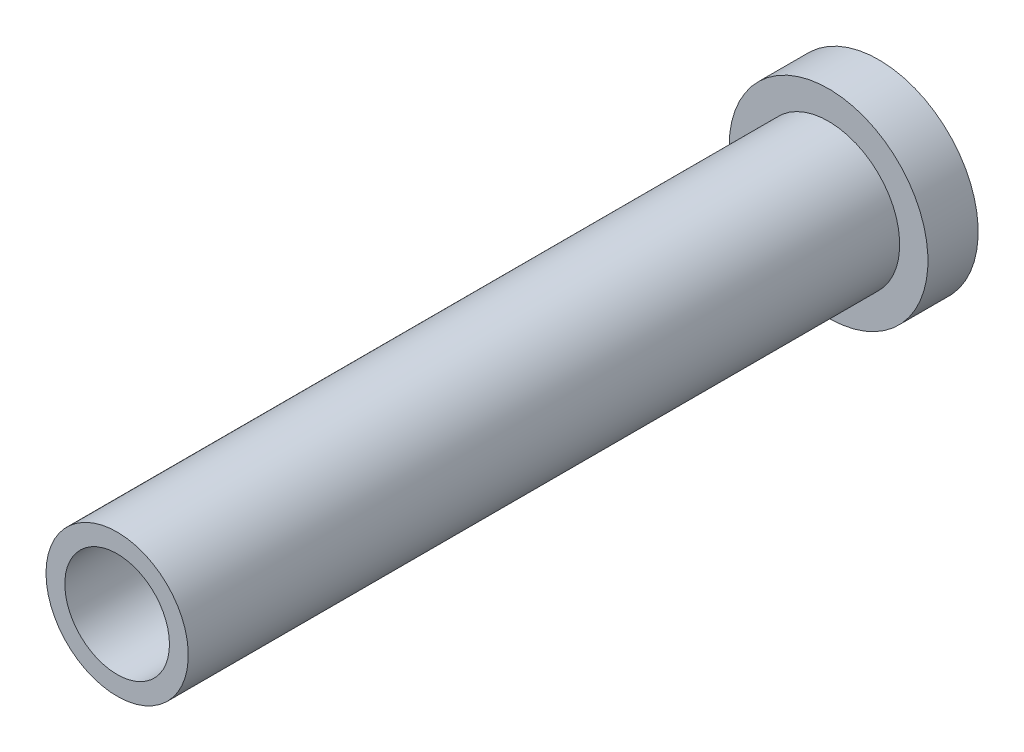
ISO-10303-21;
HEADER;
FILE_DESCRIPTION(('STEP AP214'),'2;1');
FILE_NAME('part.step','',(''),(''),'','','');
FILE_SCHEMA(('AUTOMOTIVE_DESIGN { 1 0 10303 214 1 1 1 1 }'));
ENDSEC;
DATA;
#1=APPLICATION_CONTEXT('core data for automotive mechanical design processes');
#2=APPLICATION_PROTOCOL_DEFINITION('international standard','automotive_design',2000,#1);
#3=PRODUCT_CONTEXT('',#1,'mechanical');
#4=PRODUCT('Part','Part','',(#3));
#5=PRODUCT_RELATED_PRODUCT_CATEGORY('part','',(#4));
#6=PRODUCT_DEFINITION_FORMATION('','',#4);
#7=PRODUCT_DEFINITION_CONTEXT('part definition',#1,'design');
#8=PRODUCT_DEFINITION('design','',#6,#7);
#9=PRODUCT_DEFINITION_SHAPE('','',#8);
#10=(LENGTH_UNIT() NAMED_UNIT(*) SI_UNIT(.MILLI.,.METRE.));
#11=(NAMED_UNIT(*) PLANE_ANGLE_UNIT() SI_UNIT($,.RADIAN.));
#12=(NAMED_UNIT(*) SI_UNIT($,.STERADIAN.) SOLID_ANGLE_UNIT());
#13=UNCERTAINTY_MEASURE_WITH_UNIT(LENGTH_MEASURE(1.E-05),#10,'distance_accuracy_value','');
#14=(GEOMETRIC_REPRESENTATION_CONTEXT(3) GLOBAL_UNCERTAINTY_ASSIGNED_CONTEXT((#13)) GLOBAL_UNIT_ASSIGNED_CONTEXT((#10,
#11,#12)) REPRESENTATION_CONTEXT('',''));
#15=CARTESIAN_POINT('',(0.,0.,0.));
#16=DIRECTION('',(0.,0.,1.));
#17=DIRECTION('',(1.,0.,0.));
#18=AXIS2_PLACEMENT_3D('',#15,#16,#17);
#19=CARTESIAN_POINT('',(0.,0.,2.39999999999999));
#20=DIRECTION('',(0.,0.,-1.));
#21=DIRECTION('',(-1.,0.,0.));
#22=AXIS2_PLACEMENT_3D('',#19,#20,#21);
#23=CYLINDRICAL_SURFACE('',#22,4.75);
#24=CARTESIAN_POINT('',(0.,0.,2.39999999999999));
#25=DIRECTION('',(0.,0.,1.));
#26=DIRECTION('',(1.,0.,0.));
#27=AXIS2_PLACEMENT_3D('',#24,#25,#26);
#28=CIRCLE('',#27,4.75);
#29=CARTESIAN_POINT('',(-4.74999999999994,0.,2.39999999999999));
#30=VERTEX_POINT('',#29);
#31=EDGE_CURVE('E39',#30,#30,#28,.T.);
#32=CARTESIAN_POINT('',(0.,0.,0.));
#33=DIRECTION('',(0.,0.,1.));
#34=DIRECTION('',(1.,0.,0.));
#35=AXIS2_PLACEMENT_3D('',#32,#33,#34);
#36=CIRCLE('',#35,4.75);
#37=CARTESIAN_POINT('',(-4.74999999999994,0.,0.));
#38=VERTEX_POINT('',#37);
#39=EDGE_CURVE('E35',#38,#38,#36,.T.);
#40=CARTESIAN_POINT('',(-4.74999999999994,0.,2.39999999999999));
#41=CARTESIAN_POINT('',(-4.74999999999994,0.,2.37499999999999));
#42=CARTESIAN_POINT('',(-4.74999999999994,0.,2.34999999999999));
#43=CARTESIAN_POINT('',(-4.74999999999994,0.,2.29999999999999));
#44=CARTESIAN_POINT('',(-4.74999999999994,0.,2.27499999999999));
#45=CARTESIAN_POINT('',(-4.74999999999994,0.,2.22499999999999));
#46=CARTESIAN_POINT('',(-4.74999999999994,0.,2.19999999999999));
#47=CARTESIAN_POINT('',(-4.74999999999994,0.,2.14999999999999));
#48=CARTESIAN_POINT('',(-4.74999999999994,0.,2.12499999999999));
#49=CARTESIAN_POINT('',(-4.74999999999994,0.,2.07499999999999));
#50=CARTESIAN_POINT('',(-4.74999999999994,0.,2.04999999999999));
#51=CARTESIAN_POINT('',(-4.74999999999994,0.,1.99999999999999));
#52=CARTESIAN_POINT('',(-4.74999999999994,0.,1.97499999999999));
#53=CARTESIAN_POINT('',(-4.74999999999994,0.,1.92499999999999));
#54=CARTESIAN_POINT('',(-4.74999999999994,0.,1.89999999999999));
#55=CARTESIAN_POINT('',(-4.74999999999994,0.,1.84999999999999));
#56=CARTESIAN_POINT('',(-4.74999999999994,0.,1.82499999999999));
#57=CARTESIAN_POINT('',(-4.74999999999994,0.,1.77499999999999));
#58=CARTESIAN_POINT('',(-4.74999999999994,0.,1.74999999999999));
#59=CARTESIAN_POINT('',(-4.74999999999994,0.,1.69999999999999));
#60=CARTESIAN_POINT('',(-4.74999999999994,0.,1.67499999999999));
#61=CARTESIAN_POINT('',(-4.74999999999994,0.,1.62499999999999));
#62=CARTESIAN_POINT('',(-4.74999999999994,0.,1.59999999999999));
#63=CARTESIAN_POINT('',(-4.74999999999994,0.,1.54999999999999));
#64=CARTESIAN_POINT('',(-4.74999999999994,0.,1.52499999999999));
#65=CARTESIAN_POINT('',(-4.74999999999994,0.,1.475));
#66=CARTESIAN_POINT('',(-4.74999999999994,0.,1.45));
#67=CARTESIAN_POINT('',(-4.74999999999994,0.,1.4));
#68=CARTESIAN_POINT('',(-4.74999999999994,0.,1.375));
#69=CARTESIAN_POINT('',(-4.74999999999994,0.,1.325));
#70=CARTESIAN_POINT('',(-4.74999999999994,0.,1.3));
#71=CARTESIAN_POINT('',(-4.74999999999994,0.,1.25));
#72=CARTESIAN_POINT('',(-4.74999999999994,0.,1.225));
#73=CARTESIAN_POINT('',(-4.74999999999994,0.,1.175));
#74=CARTESIAN_POINT('',(-4.74999999999994,0.,1.15));
#75=CARTESIAN_POINT('',(-4.74999999999994,0.,1.1));
#76=CARTESIAN_POINT('',(-4.74999999999994,0.,1.075));
#77=CARTESIAN_POINT('',(-4.74999999999994,0.,1.025));
#78=CARTESIAN_POINT('',(-4.74999999999994,0.,0.999999999999997));
#79=CARTESIAN_POINT('',(-4.74999999999994,0.,0.949999999999997));
#80=CARTESIAN_POINT('',(-4.74999999999994,0.,0.924999999999997));
#81=CARTESIAN_POINT('',(-4.74999999999994,0.,0.874999999999997));
#82=CARTESIAN_POINT('',(-4.74999999999994,0.,0.849999999999997));
#83=CARTESIAN_POINT('',(-4.74999999999994,0.,0.799999999999997));
#84=CARTESIAN_POINT('',(-4.74999999999994,0.,0.774999999999997));
#85=CARTESIAN_POINT('',(-4.74999999999994,0.,0.724999999999997));
#86=CARTESIAN_POINT('',(-4.74999999999994,0.,0.699999999999998));
#87=CARTESIAN_POINT('',(-4.74999999999994,0.,0.649999999999998));
#88=CARTESIAN_POINT('',(-4.74999999999994,0.,0.624999999999998));
#89=CARTESIAN_POINT('',(-4.74999999999994,0.,0.574999999999998));
#90=CARTESIAN_POINT('',(-4.74999999999994,0.,0.549999999999998));
#91=CARTESIAN_POINT('',(-4.74999999999994,0.,0.499999999999998));
#92=CARTESIAN_POINT('',(-4.74999999999994,0.,0.474999999999998));
#93=CARTESIAN_POINT('',(-4.74999999999994,0.,0.424999999999998));
#94=CARTESIAN_POINT('',(-4.74999999999994,0.,0.399999999999998));
#95=CARTESIAN_POINT('',(-4.74999999999994,0.,0.349999999999999));
#96=CARTESIAN_POINT('',(-4.74999999999994,0.,0.324999999999999));
#97=CARTESIAN_POINT('',(-4.74999999999994,0.,0.274999999999999));
#98=CARTESIAN_POINT('',(-4.74999999999994,0.,0.249999999999999));
#99=CARTESIAN_POINT('',(-4.74999999999994,0.,0.199999999999999));
#100=CARTESIAN_POINT('',(-4.74999999999994,0.,0.174999999999999));
#101=CARTESIAN_POINT('',(-4.74999999999994,0.,0.124999999999999));
#102=CARTESIAN_POINT('',(-4.74999999999994,0.,0.0999999999999994));
#103=CARTESIAN_POINT('',(-4.74999999999994,0.,0.0499999999999996));
#104=CARTESIAN_POINT('',(-4.74999999999994,0.,0.0249999999999996));
#105=CARTESIAN_POINT('',(-4.74999999999994,0.,0.));
#106=B_SPLINE_CURVE_WITH_KNOTS('',3,(#40,#41,#42,#43,#44,#45,#46,#47,#48,#49,#50,#51,#52,#53,
#54,#55,#56,#57,#58,#59,#60,#61,#62,#63,#64,#65,#66,#67,#68,#69,#70,#71,#72,#73,#74,#75,#76,#77,
#78,#79,#80,#81,#82,#83,#84,#85,#86,#87,#88,#89,#90,#91,#92,#93,#94,#95,#96,#97,#98,#99,#100,
#101,#102,#103,#104,#105),.UNSPECIFIED.,.F.,.F.,(4,2,2,2,2,2,2,2,2,2,2,2,2,2,2,2,2,2,2,2,2,2,2,
2,2,2,2,2,2,2,2,2,4),(0.,0.075,0.15,0.225,0.299999999999999,0.374999999999999,0.449999999999999,
0.524999999999999,0.599999999999999,0.674999999999998,0.749999999999998,0.824999999999998,
0.899999999999997,0.974999999999997,1.05,1.125,1.2,1.275,1.35,1.425,1.5,1.575,1.65,
1.72499999999999,1.79999999999999,1.87499999999999,1.94999999999999,2.02499999999999,
2.09999999999999,2.17499999999999,2.24999999999999,2.32499999999999,2.39999999999999),.UNSPECIFIED.);
#107=EDGE_CURVE('BSEAM32',#30,#38,#106,.T.);
#108=ORIENTED_EDGE('',*,*,#31,.F.);
#109=ORIENTED_EDGE('',*,*,#39,.T.);
#110=ORIENTED_EDGE('',*,*,#107,.T.);
#111=ORIENTED_EDGE('',*,*,#107,.F.);
#112=EDGE_LOOP('',(#108,#110,#109,#111));
#113=FACE_BOUND('',#112,.T.);
#114=ADVANCED_FACE('F32',(#113),#23,.T.);
#115=CARTESIAN_POINT('',(0.,0.,2.39999999999999));
#116=DIRECTION('',(0.,0.,1.));
#117=DIRECTION('',(1.,0.,0.));
#118=AXIS2_PLACEMENT_3D('',#115,#116,#117);
#119=PLANE('',#118);
#120=CARTESIAN_POINT('',(0.,0.,2.39999999999999));
#121=DIRECTION('',(0.,0.,1.));
#122=DIRECTION('',(1.,0.,0.));
#123=AXIS2_PLACEMENT_3D('',#120,#121,#122);
#124=CIRCLE('',#123,3.4);
#125=CARTESIAN_POINT('',(-3.4,0.,2.39999999999999));
#126=VERTEX_POINT('',#125);
#127=EDGE_CURVE('E10',#126,#126,#124,.T.);
#128=ORIENTED_EDGE('',*,*,#127,.F.);
#129=EDGE_LOOP('',(#128));
#130=FACE_BOUND('',#129,.T.);
#131=ORIENTED_EDGE('',*,*,#31,.T.);
#132=EDGE_LOOP('',(#131));
#133=FACE_BOUND('',#132,.T.);
#134=ADVANCED_FACE('F76',(#130,#133),#119,.T.);
#135=CARTESIAN_POINT('',(0.,0.,0.));
#136=DIRECTION('',(0.,0.,1.));
#137=DIRECTION('',(1.,0.,0.));
#138=AXIS2_PLACEMENT_3D('',#135,#136,#137);
#139=PLANE('',#138);
#140=ORIENTED_EDGE('',*,*,#39,.F.);
#141=EDGE_LOOP('',(#140));
#142=FACE_BOUND('',#141,.T.);
#143=ADVANCED_FACE('F71',(#142),#139,.F.);
#144=CARTESIAN_POINT('',(0.,0.,36.4));
#145=DIRECTION('',(0.,0.,-1.));
#146=DIRECTION('',(-1.,0.,0.));
#147=AXIS2_PLACEMENT_3D('',#144,#145,#146);
#148=CYLINDRICAL_SURFACE('',#147,3.4);
#149=CARTESIAN_POINT('',(0.,0.,36.4));
#150=DIRECTION('',(0.,0.,1.));
#151=DIRECTION('',(1.,0.,0.));
#152=AXIS2_PLACEMENT_3D('',#149,#150,#151);
#153=CIRCLE('',#152,3.4);
#154=CARTESIAN_POINT('',(-3.4,0.,36.4));
#155=VERTEX_POINT('',#154);
#156=EDGE_CURVE('E45',#155,#155,#153,.T.);
#157=CARTESIAN_POINT('',(-3.4,0.,36.4));
#158=CARTESIAN_POINT('',(-3.4,0.,36.0458333333333));
#159=CARTESIAN_POINT('',(-3.4,0.,35.6916666666666));
#160=CARTESIAN_POINT('',(-3.4,0.,34.9833333333333));
#161=CARTESIAN_POINT('',(-3.4,0.,34.6291666666666));
#162=CARTESIAN_POINT('',(-3.4,0.,33.9208333333333));
#163=CARTESIAN_POINT('',(-3.4,0.,33.5666666666666));
#164=CARTESIAN_POINT('',(-3.4,0.,32.8583333333333));
#165=CARTESIAN_POINT('',(-3.4,0.,32.5041666666666));
#166=CARTESIAN_POINT('',(-3.4,0.,31.7958333333333));
#167=CARTESIAN_POINT('',(-3.4,0.,31.4416666666666));
#168=CARTESIAN_POINT('',(-3.4,0.,30.7333333333333));
#169=CARTESIAN_POINT('',(-3.4,0.,30.3791666666666));
#170=CARTESIAN_POINT('',(-3.4,0.,29.6708333333333));
#171=CARTESIAN_POINT('',(-3.4,0.,29.3166666666666));
#172=CARTESIAN_POINT('',(-3.4,0.,28.6083333333333));
#173=CARTESIAN_POINT('',(-3.4,0.,28.2541666666666));
#174=CARTESIAN_POINT('',(-3.4,0.,27.5458333333333));
#175=CARTESIAN_POINT('',(-3.4,0.,27.1916666666666));
#176=CARTESIAN_POINT('',(-3.4,0.,26.4833333333333));
#177=CARTESIAN_POINT('',(-3.4,0.,26.1291666666666));
#178=CARTESIAN_POINT('',(-3.4,0.,25.4208333333333));
#179=CARTESIAN_POINT('',(-3.4,0.,25.0666666666666));
#180=CARTESIAN_POINT('',(-3.4,0.,24.3583333333333));
#181=CARTESIAN_POINT('',(-3.4,0.,24.0041666666666));
#182=CARTESIAN_POINT('',(-3.4,0.,23.2958333333333));
#183=CARTESIAN_POINT('',(-3.4,0.,22.9416666666666));
#184=CARTESIAN_POINT('',(-3.4,0.,22.2333333333333));
#185=CARTESIAN_POINT('',(-3.4,0.,21.8791666666666));
#186=CARTESIAN_POINT('',(-3.4,0.,21.1708333333333));
#187=CARTESIAN_POINT('',(-3.4,0.,20.8166666666666));
#188=CARTESIAN_POINT('',(-3.4,0.,20.1083333333333));
#189=CARTESIAN_POINT('',(-3.4,0.,19.7541666666666));
#190=CARTESIAN_POINT('',(-3.4,0.,19.0458333333333));
#191=CARTESIAN_POINT('',(-3.4,0.,18.6916666666666));
#192=CARTESIAN_POINT('',(-3.4,0.,17.9833333333333));
#193=CARTESIAN_POINT('',(-3.4,0.,17.6291666666666));
#194=CARTESIAN_POINT('',(-3.4,0.,16.9208333333333));
#195=CARTESIAN_POINT('',(-3.4,0.,16.5666666666666));
#196=CARTESIAN_POINT('',(-3.4,0.,15.8583333333333));
#197=CARTESIAN_POINT('',(-3.4,0.,15.5041666666666));
#198=CARTESIAN_POINT('',(-3.4,0.,14.7958333333333));
#199=CARTESIAN_POINT('',(-3.4,0.,14.4416666666666));
#200=CARTESIAN_POINT('',(-3.4,0.,13.7333333333333));
#201=CARTESIAN_POINT('',(-3.4,0.,13.3791666666666));
#202=CARTESIAN_POINT('',(-3.4,0.,12.6708333333333));
#203=CARTESIAN_POINT('',(-3.4,0.,12.3166666666666));
#204=CARTESIAN_POINT('',(-3.4,0.,11.6083333333333));
#205=CARTESIAN_POINT('',(-3.4,0.,11.2541666666666));
#206=CARTESIAN_POINT('',(-3.4,0.,10.5458333333333));
#207=CARTESIAN_POINT('',(-3.4,0.,10.1916666666666));
#208=CARTESIAN_POINT('',(-3.4,0.,9.48333333333332));
#209=CARTESIAN_POINT('',(-3.4,0.,9.12916666666665));
#210=CARTESIAN_POINT('',(-3.4,0.,8.42083333333332));
#211=CARTESIAN_POINT('',(-3.4,0.,8.06666666666665));
#212=CARTESIAN_POINT('',(-3.4,0.,7.35833333333332));
#213=CARTESIAN_POINT('',(-3.4,0.,7.00416666666665));
#214=CARTESIAN_POINT('',(-3.4,0.,6.29583333333332));
#215=CARTESIAN_POINT('',(-3.4,0.,5.94166666666665));
#216=CARTESIAN_POINT('',(-3.4,0.,5.23333333333332));
#217=CARTESIAN_POINT('',(-3.4,0.,4.87916666666665));
#218=CARTESIAN_POINT('',(-3.4,0.,4.17083333333332));
#219=CARTESIAN_POINT('',(-3.4,0.,3.81666666666665));
#220=CARTESIAN_POINT('',(-3.4,0.,3.10833333333332));
#221=CARTESIAN_POINT('',(-3.4,0.,2.75416666666665));
#222=CARTESIAN_POINT('',(-3.4,0.,2.39999999999999));
#223=B_SPLINE_CURVE_WITH_KNOTS('',3,(#157,#158,#159,#160,#161,#162,#163,#164,#165,#166,#167,
#168,#169,#170,#171,#172,#173,#174,#175,#176,#177,#178,#179,#180,#181,#182,#183,#184,#185,#186,
#187,#188,#189,#190,#191,#192,#193,#194,#195,#196,#197,#198,#199,#200,#201,#202,#203,#204,#205,
#206,#207,#208,#209,#210,#211,#212,#213,#214,#215,#216,#217,#218,#219,#220,#221,#222),
.UNSPECIFIED.,.F.,.F.,(4,2,2,2,2,2,2,2,2,2,2,2,2,2,2,2,2,2,2,2,2,2,2,2,2,2,2,2,2,2,2,2,4),(0.,
1.06249999999999,2.125,3.1875,4.24999999999999,5.31249999999999,6.37499999999999,
7.43749999999999,8.49999999999999,9.56249999999999,10.625,11.6875,12.75,13.8125,14.875,15.9375,
17.,18.0625,19.125,20.1875,21.25,22.3125,23.375,24.4375,25.5,26.5625,27.625,28.6875,29.75,
30.8125,31.875,32.9375,34.),.UNSPECIFIED.);
#224=EDGE_CURVE('BSEAM66',#155,#126,#223,.T.);
#225=ORIENTED_EDGE('',*,*,#156,.F.);
#226=ORIENTED_EDGE('',*,*,#127,.T.);
#227=ORIENTED_EDGE('',*,*,#224,.T.);
#228=ORIENTED_EDGE('',*,*,#224,.F.);
#229=EDGE_LOOP('',(#225,#227,#226,#228));
#230=FACE_BOUND('',#229,.T.);
#231=ADVANCED_FACE('F66',(#230),#148,.T.);
#232=CARTESIAN_POINT('',(0.,0.,36.4));
#233=DIRECTION('',(0.,0.,1.));
#234=DIRECTION('',(1.,0.,0.));
#235=AXIS2_PLACEMENT_3D('',#232,#233,#234);
#236=PLANE('',#235);
#237=CARTESIAN_POINT('',(0.,0.,36.4));
#238=DIRECTION('',(0.,0.,1.));
#239=DIRECTION('',(1.,0.,0.));
#240=AXIS2_PLACEMENT_3D('',#237,#238,#239);
#241=CIRCLE('',#240,2.5);
#242=CARTESIAN_POINT('',(2.5,0.,36.4));
#243=VERTEX_POINT('',#242);
#244=EDGE_CURVE('E49',#243,#243,#241,.T.);
#245=ORIENTED_EDGE('',*,*,#244,.F.);
#246=EDGE_LOOP('',(#245));
#247=FACE_BOUND('',#246,.T.);
#248=ORIENTED_EDGE('',*,*,#156,.T.);
#249=EDGE_LOOP('',(#248));
#250=FACE_BOUND('',#249,.T.);
#251=ADVANCED_FACE('F60',(#247,#250),#236,.T.);
#252=CARTESIAN_POINT('',(0.,0.,31.));
#253=DIRECTION('',(0.,0.,1.));
#254=DIRECTION('',(1.,0.,0.));
#255=AXIS2_PLACEMENT_3D('',#252,#253,#254);
#256=CYLINDRICAL_SURFACE('',#255,2.5);
#257=CARTESIAN_POINT('',(0.,0.,31.));
#258=DIRECTION('',(0.,0.,1.));
#259=DIRECTION('',(1.,0.,0.));
#260=AXIS2_PLACEMENT_3D('',#257,#258,#259);
#261=CIRCLE('',#260,2.5);
#262=CARTESIAN_POINT('',(2.5,0.,31.));
#263=VERTEX_POINT('',#262);
#264=EDGE_CURVE('E48',#263,#263,#261,.T.);
#265=CARTESIAN_POINT('',(2.5,0.,31.));
#266=CARTESIAN_POINT('',(2.5,0.,31.05625));
#267=CARTESIAN_POINT('',(2.5,0.,31.1125));
#268=CARTESIAN_POINT('',(2.5,0.,31.225));
#269=CARTESIAN_POINT('',(2.5,0.,31.28125));
#270=CARTESIAN_POINT('',(2.5,0.,31.39375));
#271=CARTESIAN_POINT('',(2.5,0.,31.45));
#272=CARTESIAN_POINT('',(2.5,0.,31.5625));
#273=CARTESIAN_POINT('',(2.5,0.,31.61875));
#274=CARTESIAN_POINT('',(2.5,0.,31.73125));
#275=CARTESIAN_POINT('',(2.5,0.,31.7875));
#276=CARTESIAN_POINT('',(2.5,0.,31.9));
#277=CARTESIAN_POINT('',(2.5,0.,31.95625));
#278=CARTESIAN_POINT('',(2.5,0.,32.06875));
#279=CARTESIAN_POINT('',(2.5,0.,32.125));
#280=CARTESIAN_POINT('',(2.5,0.,32.2375));
#281=CARTESIAN_POINT('',(2.5,0.,32.29375));
#282=CARTESIAN_POINT('',(2.5,0.,32.40625));
#283=CARTESIAN_POINT('',(2.5,0.,32.4625));
#284=CARTESIAN_POINT('',(2.5,0.,32.575));
#285=CARTESIAN_POINT('',(2.5,0.,32.63125));
#286=CARTESIAN_POINT('',(2.5,0.,32.74375));
#287=CARTESIAN_POINT('',(2.5,0.,32.8));
#288=CARTESIAN_POINT('',(2.5,0.,32.9125));
#289=CARTESIAN_POINT('',(2.5,0.,32.96875));
#290=CARTESIAN_POINT('',(2.5,0.,33.08125));
#291=CARTESIAN_POINT('',(2.5,0.,33.1375));
#292=CARTESIAN_POINT('',(2.5,0.,33.25));
#293=CARTESIAN_POINT('',(2.5,0.,33.30625));
#294=CARTESIAN_POINT('',(2.5,0.,33.41875));
#295=CARTESIAN_POINT('',(2.5,0.,33.475));
#296=CARTESIAN_POINT('',(2.5,0.,33.5875));
#297=CARTESIAN_POINT('',(2.5,0.,33.64375));
#298=CARTESIAN_POINT('',(2.5,0.,33.75625));
#299=CARTESIAN_POINT('',(2.5,0.,33.8125));
#300=CARTESIAN_POINT('',(2.5,0.,33.925));
#301=CARTESIAN_POINT('',(2.5,0.,33.98125));
#302=CARTESIAN_POINT('',(2.5,0.,34.09375));
#303=CARTESIAN_POINT('',(2.5,0.,34.15));
#304=CARTESIAN_POINT('',(2.5,0.,34.2625));
#305=CARTESIAN_POINT('',(2.5,0.,34.31875));
#306=CARTESIAN_POINT('',(2.5,0.,34.43125));
#307=CARTESIAN_POINT('',(2.5,0.,34.4875));
#308=CARTESIAN_POINT('',(2.5,0.,34.6));
#309=CARTESIAN_POINT('',(2.5,0.,34.65625));
#310=CARTESIAN_POINT('',(2.5,0.,34.76875));
#311=CARTESIAN_POINT('',(2.5,0.,34.825));
#312=CARTESIAN_POINT('',(2.5,0.,34.9375));
#313=CARTESIAN_POINT('',(2.5,0.,34.99375));
#314=CARTESIAN_POINT('',(2.5,0.,35.10625));
#315=CARTESIAN_POINT('',(2.5,0.,35.1625));
#316=CARTESIAN_POINT('',(2.5,0.,35.275));
#317=CARTESIAN_POINT('',(2.5,0.,35.33125));
#318=CARTESIAN_POINT('',(2.5,0.,35.44375));
#319=CARTESIAN_POINT('',(2.5,0.,35.5));
#320=CARTESIAN_POINT('',(2.5,0.,35.6125));
#321=CARTESIAN_POINT('',(2.5,0.,35.66875));
#322=CARTESIAN_POINT('',(2.5,0.,35.78125));
#323=CARTESIAN_POINT('',(2.5,0.,35.8375));
#324=CARTESIAN_POINT('',(2.5,0.,35.95));
#325=CARTESIAN_POINT('',(2.5,0.,36.00625));
#326=CARTESIAN_POINT('',(2.5,0.,36.11875));
#327=CARTESIAN_POINT('',(2.5,0.,36.175));
#328=CARTESIAN_POINT('',(2.5,0.,36.2875));
#329=CARTESIAN_POINT('',(2.5,0.,36.34375));
#330=CARTESIAN_POINT('',(2.5,0.,36.4));
#331=B_SPLINE_CURVE_WITH_KNOTS('',3,(#265,#266,#267,#268,#269,#270,#271,#272,#273,#274,#275,
#276,#277,#278,#279,#280,#281,#282,#283,#284,#285,#286,#287,#288,#289,#290,#291,#292,#293,#294,
#295,#296,#297,#298,#299,#300,#301,#302,#303,#304,#305,#306,#307,#308,#309,#310,#311,#312,#313,
#314,#315,#316,#317,#318,#319,#320,#321,#322,#323,#324,#325,#326,#327,#328,#329,#330),
.UNSPECIFIED.,.F.,.F.,(4,2,2,2,2,2,2,2,2,2,2,2,2,2,2,2,2,2,2,2,2,2,2,2,2,2,2,2,2,2,2,2,4),(0.,
0.168749999999999,0.337500000000001,0.506249999999996,0.674999999999998,0.843750000000001,
1.0125,1.18125,1.35,1.51875,1.6875,1.85625,2.025,2.19375,2.3625,2.53125,2.7,2.86875,3.0375,
3.20625,3.375,3.54374999999999,3.7125,3.88125,4.04999999999999,4.21875,4.3875,4.55624999999999,
4.725,4.89375,5.06249999999999,5.23125,5.4),.UNSPECIFIED.);
#332=EDGE_CURVE('BSEAM57',#263,#243,#331,.T.);
#333=ORIENTED_EDGE('',*,*,#264,.F.);
#334=ORIENTED_EDGE('',*,*,#244,.T.);
#335=ORIENTED_EDGE('',*,*,#332,.T.);
#336=ORIENTED_EDGE('',*,*,#332,.F.);
#337=EDGE_LOOP('',(#333,#335,#334,#336));
#338=FACE_BOUND('',#337,.T.);
#339=ADVANCED_FACE('F57',(#338),#256,.F.);
#340=CARTESIAN_POINT('',(0.,0.,31.));
#341=DIRECTION('',(0.,0.,1.));
#342=DIRECTION('',(1.,0.,0.));
#343=AXIS2_PLACEMENT_3D('',#340,#341,#342);
#344=PLANE('',#343);
#345=ORIENTED_EDGE('',*,*,#264,.T.);
#346=EDGE_LOOP('',(#345));
#347=FACE_BOUND('',#346,.T.);
#348=ADVANCED_FACE('F55',(#347),#344,.T.);
#349=CLOSED_SHELL('',(#114,#134,#143,#231,#251,#339,#348));
#350=MANIFOLD_SOLID_BREP('B2',#349);
#351=ADVANCED_BREP_SHAPE_REPRESENTATION('',(#18,#350),#14);
#352=SHAPE_DEFINITION_REPRESENTATION(#9,#351);
ENDSEC;
END-ISO-10303-21;
